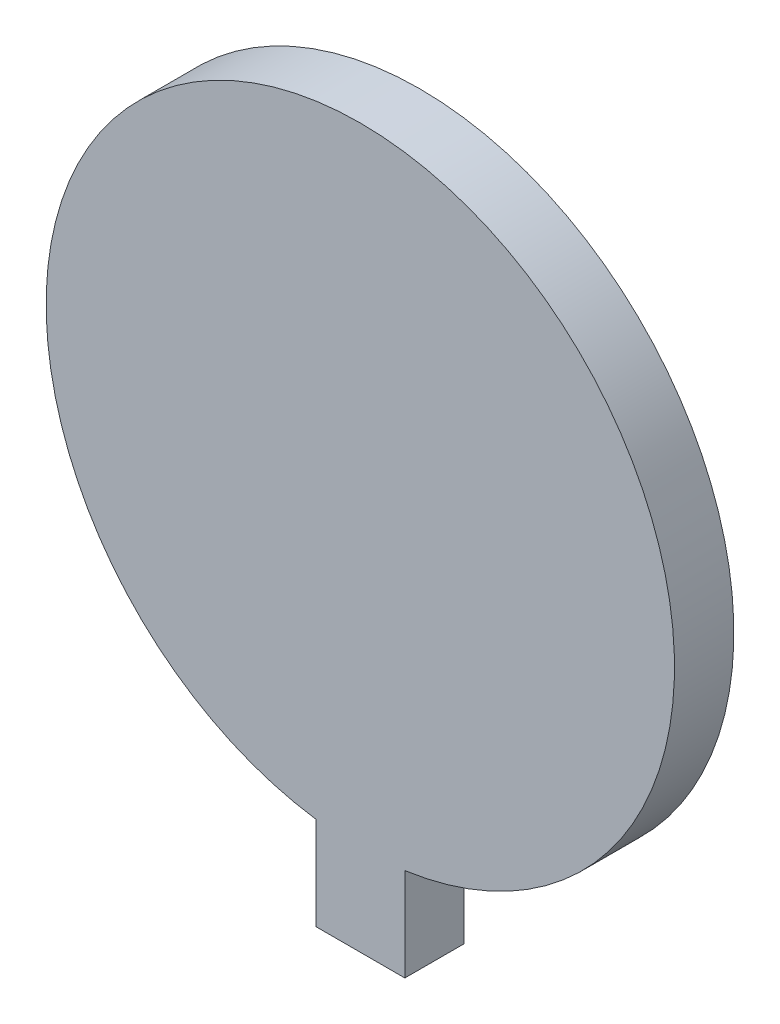
ISO-10303-21;
HEADER;
FILE_DESCRIPTION(('STEP AP214'),'2;1');
FILE_NAME('part.step','',(''),(''),'','','');
FILE_SCHEMA(('AUTOMOTIVE_DESIGN { 1 0 10303 214 1 1 1 1 }'));
ENDSEC;
DATA;
#1=APPLICATION_CONTEXT('core data for automotive mechanical design processes');
#2=APPLICATION_PROTOCOL_DEFINITION('international standard','automotive_design',2000,#1);
#3=PRODUCT_CONTEXT('',#1,'mechanical');
#4=PRODUCT('Part','Part','',(#3));
#5=PRODUCT_RELATED_PRODUCT_CATEGORY('part','',(#4));
#6=PRODUCT_DEFINITION_FORMATION('','',#4);
#7=PRODUCT_DEFINITION_CONTEXT('part definition',#1,'design');
#8=PRODUCT_DEFINITION('design','',#6,#7);
#9=PRODUCT_DEFINITION_SHAPE('','',#8);
#10=(LENGTH_UNIT() NAMED_UNIT(*) SI_UNIT(.MILLI.,.METRE.));
#11=(NAMED_UNIT(*) PLANE_ANGLE_UNIT() SI_UNIT($,.RADIAN.));
#12=(NAMED_UNIT(*) SI_UNIT($,.STERADIAN.) SOLID_ANGLE_UNIT());
#13=UNCERTAINTY_MEASURE_WITH_UNIT(LENGTH_MEASURE(1.E-05),#10,'distance_accuracy_value','');
#14=(GEOMETRIC_REPRESENTATION_CONTEXT(3) GLOBAL_UNCERTAINTY_ASSIGNED_CONTEXT((#13)) GLOBAL_UNIT_ASSIGNED_CONTEXT((#10,
#11,#12)) REPRESENTATION_CONTEXT('',''));
#15=CARTESIAN_POINT('',(0.,0.,0.));
#16=DIRECTION('',(0.,0.,1.));
#17=DIRECTION('',(1.,0.,0.));
#18=AXIS2_PLACEMENT_3D('',#15,#16,#17);
#19=CARTESIAN_POINT('',(0.,0.908019807691184,0.));
#20=DIRECTION('',(0.,0.,1.));
#21=DIRECTION('',(1.,0.,0.));
#22=AXIS2_PLACEMENT_3D('',#19,#20,#21);
#23=PLANE('',#22);
#24=CARTESIAN_POINT('',(0.,0.908019807691184,0.));
#25=DIRECTION('',(0.,0.,1.));
#26=DIRECTION('',(1.,0.,0.));
#27=AXIS2_PLACEMENT_3D('',#24,#25,#26);
#28=CIRCLE('',#27,6.35);
#29=CARTESIAN_POINT('',(0.899999999999996,-5.37787710524018,0.));
#30=VERTEX_POINT('',#29);
#31=CARTESIAN_POINT('',(-0.9,-5.37787710524018,0.));
#32=VERTEX_POINT('',#31);
#33=EDGE_CURVE('E92',#30,#32,#28,.T.);
#34=ORIENTED_EDGE('',*,*,#33,.F.);
#35=DIRECTION('',(0.,1.,0.));
#36=VECTOR('',#35,1.);
#37=CARTESIAN_POINT('',(0.900000000000001,-7.95801980769118,0.));
#38=LINE('',#37,#36);
#39=CARTESIAN_POINT('',(0.9,-7.25801980769118,0.));
#40=VERTEX_POINT('',#39);
#41=EDGE_CURVE('E112',#40,#30,#38,.T.);
#42=ORIENTED_EDGE('',*,*,#41,.F.);
#43=DIRECTION('',(1.,0.,0.));
#44=VECTOR('',#43,1.);
#45=CARTESIAN_POINT('',(-1.6,-7.25801980769118,0.));
#46=LINE('',#45,#44);
#47=CARTESIAN_POINT('',(-0.899999999999999,-7.25801980769118,0.));
#48=VERTEX_POINT('',#47);
#49=EDGE_CURVE('E119',#48,#40,#46,.T.);
#50=ORIENTED_EDGE('',*,*,#49,.F.);
#51=DIRECTION('',(0.,-1.,0.));
#52=VECTOR('',#51,1.);
#53=CARTESIAN_POINT('',(-0.899999999999999,-5.95801980769118,0.));
#54=LINE('',#53,#52);
#55=EDGE_CURVE('E125',#32,#48,#54,.T.);
#56=ORIENTED_EDGE('',*,*,#55,.F.);
#57=EDGE_LOOP('',(#34,#42,#50,#56));
#58=FACE_BOUND('',#57,.T.);
#59=ADVANCED_FACE('F67',(#58),#23,.F.);
#60=CARTESIAN_POINT('',(0.,0.908019807691184,0.));
#61=DIRECTION('',(0.,0.,1.));
#62=DIRECTION('',(1.,0.,0.));
#63=AXIS2_PLACEMENT_3D('',#60,#61,#62);
#64=CYLINDRICAL_SURFACE('',#63,6.35);
#65=CARTESIAN_POINT('',(0.,0.908019807691184,1.2));
#66=DIRECTION('',(0.,0.,1.));
#67=DIRECTION('',(1.,0.,0.));
#68=AXIS2_PLACEMENT_3D('',#65,#66,#67);
#69=CIRCLE('',#68,6.35);
#70=CARTESIAN_POINT('',(0.899999999999996,-5.37787710524018,1.2));
#71=VERTEX_POINT('',#70);
#72=CARTESIAN_POINT('',(-0.9,-5.37787710524018,1.2));
#73=VERTEX_POINT('',#72);
#74=EDGE_CURVE('E132',#71,#73,#69,.T.);
#75=ORIENTED_EDGE('',*,*,#74,.F.);
#76=DIRECTION('',(0.,0.,1.));
#77=VECTOR('',#76,1.);
#78=CARTESIAN_POINT('',(0.899999999999996,-5.37787710524018,0.));
#79=LINE('',#78,#77);
#80=EDGE_CURVE('E12',#30,#71,#79,.T.);
#81=ORIENTED_EDGE('',*,*,#80,.F.);
#82=ORIENTED_EDGE('',*,*,#33,.T.);
#83=DIRECTION('',(0.,0.,1.));
#84=VECTOR('',#83,1.);
#85=CARTESIAN_POINT('',(-0.9,-5.37787710524018,0.));
#86=LINE('',#85,#84);
#87=EDGE_CURVE('E70',#32,#73,#86,.T.);
#88=ORIENTED_EDGE('',*,*,#87,.T.);
#89=EDGE_LOOP('',(#75,#81,#82,#88));
#90=FACE_BOUND('',#89,.T.);
#91=ADVANCED_FACE('F150',(#90),#64,.T.);
#92=CARTESIAN_POINT('',(0.900000000000001,-7.95801980769118,0.));
#93=DIRECTION('',(1.,0.,0.));
#94=DIRECTION('',(0.,1.,0.));
#95=AXIS2_PLACEMENT_3D('',#92,#93,#94);
#96=PLANE('',#95);
#97=DIRECTION('',(0.,1.,0.));
#98=VECTOR('',#97,1.);
#99=CARTESIAN_POINT('',(0.900000000000001,-7.95801980769118,1.2));
#100=LINE('',#99,#98);
#101=CARTESIAN_POINT('',(0.9,-7.25801980769118,1.2));
#102=VERTEX_POINT('',#101);
#103=EDGE_CURVE('E114',#102,#71,#100,.T.);
#104=ORIENTED_EDGE('',*,*,#103,.F.);
#105=DIRECTION('',(0.,0.,1.));
#106=VECTOR('',#105,1.);
#107=CARTESIAN_POINT('',(0.9,-7.25801980769118,0.));
#108=LINE('',#107,#106);
#109=EDGE_CURVE('E76',#40,#102,#108,.T.);
#110=ORIENTED_EDGE('',*,*,#109,.F.);
#111=ORIENTED_EDGE('',*,*,#41,.T.);
#112=ORIENTED_EDGE('',*,*,#80,.T.);
#113=EDGE_LOOP('',(#104,#110,#111,#112));
#114=FACE_BOUND('',#113,.T.);
#115=ADVANCED_FACE('F110',(#114),#96,.T.);
#116=CARTESIAN_POINT('',(-1.6,-7.25801980769118,0.));
#117=DIRECTION('',(0.,-1.,0.));
#118=DIRECTION('',(0.,0.,-1.));
#119=AXIS2_PLACEMENT_3D('',#116,#117,#118);
#120=PLANE('',#119);
#121=DIRECTION('',(1.,0.,0.));
#122=VECTOR('',#121,1.);
#123=CARTESIAN_POINT('',(-1.6,-7.25801980769118,1.2));
#124=LINE('',#123,#122);
#125=CARTESIAN_POINT('',(-0.899999999999999,-7.25801980769118,1.2));
#126=VERTEX_POINT('',#125);
#127=EDGE_CURVE('E84',#126,#102,#124,.T.);
#128=ORIENTED_EDGE('',*,*,#127,.F.);
#129=DIRECTION('',(0.,0.,1.));
#130=VECTOR('',#129,1.);
#131=CARTESIAN_POINT('',(-0.899999999999999,-7.25801980769118,0.));
#132=LINE('',#131,#130);
#133=EDGE_CURVE('E116',#48,#126,#132,.T.);
#134=ORIENTED_EDGE('',*,*,#133,.F.);
#135=ORIENTED_EDGE('',*,*,#49,.T.);
#136=ORIENTED_EDGE('',*,*,#109,.T.);
#137=EDGE_LOOP('',(#128,#134,#135,#136));
#138=FACE_BOUND('',#137,.T.);
#139=ADVANCED_FACE('F120',(#138),#120,.T.);
#140=CARTESIAN_POINT('',(-0.899999999999999,-5.95801980769118,0.));
#141=DIRECTION('',(-1.,0.,0.));
#142=DIRECTION('',(0.,-1.,0.));
#143=AXIS2_PLACEMENT_3D('',#140,#141,#142);
#144=PLANE('',#143);
#145=DIRECTION('',(0.,-1.,0.));
#146=VECTOR('',#145,1.);
#147=CARTESIAN_POINT('',(-0.899999999999999,-5.95801980769118,1.2));
#148=LINE('',#147,#146);
#149=EDGE_CURVE('E136',#73,#126,#148,.T.);
#150=ORIENTED_EDGE('',*,*,#149,.F.);
#151=ORIENTED_EDGE('',*,*,#87,.F.);
#152=ORIENTED_EDGE('',*,*,#55,.T.);
#153=ORIENTED_EDGE('',*,*,#133,.T.);
#154=EDGE_LOOP('',(#150,#151,#152,#153));
#155=FACE_BOUND('',#154,.T.);
#156=ADVANCED_FACE('F146',(#155),#144,.T.);
#157=CARTESIAN_POINT('',(0.,0.908019807691184,1.2));
#158=DIRECTION('',(0.,0.,1.));
#159=DIRECTION('',(1.,0.,0.));
#160=AXIS2_PLACEMENT_3D('',#157,#158,#159);
#161=PLANE('',#160);
#162=ORIENTED_EDGE('',*,*,#103,.T.);
#163=ORIENTED_EDGE('',*,*,#74,.T.);
#164=ORIENTED_EDGE('',*,*,#149,.T.);
#165=ORIENTED_EDGE('',*,*,#127,.T.);
#166=EDGE_LOOP('',(#162,#163,#164,#165));
#167=FACE_BOUND('',#166,.T.);
#168=ADVANCED_FACE('F148',(#167),#161,.T.);
#169=CLOSED_SHELL('',(#59,#91,#115,#139,#156,#168));
#170=MANIFOLD_SOLID_BREP('B2',#169);
#171=ADVANCED_BREP_SHAPE_REPRESENTATION('',(#18,#170),#14);
#172=SHAPE_DEFINITION_REPRESENTATION(#9,#171);
ENDSEC;
END-ISO-10303-21;
